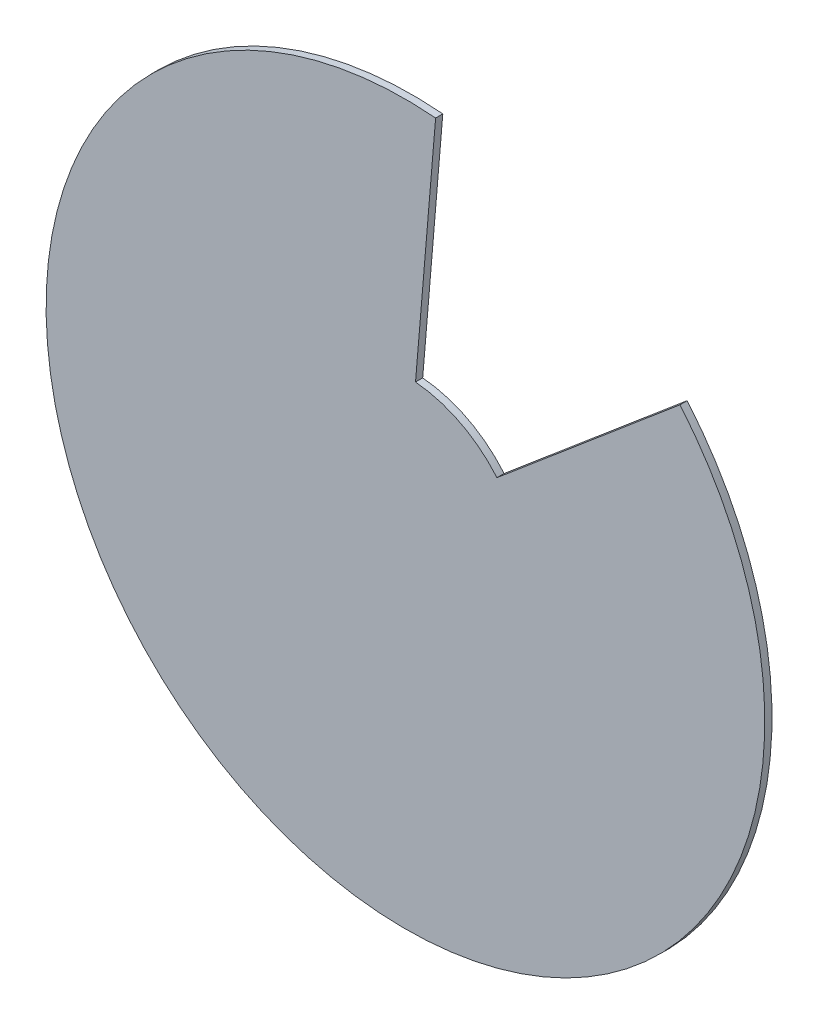
ISO-10303-21;
HEADER;
FILE_DESCRIPTION(('STEP AP214'),'2;1');
FILE_NAME('part.step','',(''),(''),'','','');
FILE_SCHEMA(('AUTOMOTIVE_DESIGN { 1 0 10303 214 1 1 1 1 }'));
ENDSEC;
DATA;
#1=APPLICATION_CONTEXT('core data for automotive mechanical design processes');
#2=APPLICATION_PROTOCOL_DEFINITION('international standard','automotive_design',2000,#1);
#3=PRODUCT_CONTEXT('',#1,'mechanical');
#4=PRODUCT('Part','Part','',(#3));
#5=PRODUCT_RELATED_PRODUCT_CATEGORY('part','',(#4));
#6=PRODUCT_DEFINITION_FORMATION('','',#4);
#7=PRODUCT_DEFINITION_CONTEXT('part definition',#1,'design');
#8=PRODUCT_DEFINITION('design','',#6,#7);
#9=PRODUCT_DEFINITION_SHAPE('','',#8);
#10=(LENGTH_UNIT() NAMED_UNIT(*) SI_UNIT(.MILLI.,.METRE.));
#11=(NAMED_UNIT(*) PLANE_ANGLE_UNIT() SI_UNIT($,.RADIAN.));
#12=(NAMED_UNIT(*) SI_UNIT($,.STERADIAN.) SOLID_ANGLE_UNIT());
#13=UNCERTAINTY_MEASURE_WITH_UNIT(LENGTH_MEASURE(1.E-05),#10,'distance_accuracy_value','');
#14=(GEOMETRIC_REPRESENTATION_CONTEXT(3) GLOBAL_UNCERTAINTY_ASSIGNED_CONTEXT((#13)) GLOBAL_UNIT_ASSIGNED_CONTEXT((#10,
#11,#12)) REPRESENTATION_CONTEXT('',''));
#15=CARTESIAN_POINT('',(0.,0.,0.));
#16=DIRECTION('',(0.,0.,1.));
#17=DIRECTION('',(1.,0.,0.));
#18=AXIS2_PLACEMENT_3D('',#15,#16,#17);
#19=CARTESIAN_POINT('',(0.,0.,3.));
#20=DIRECTION('',(0.,0.,-1.));
#21=DIRECTION('',(-1.,0.,0.));
#22=AXIS2_PLACEMENT_3D('',#19,#20,#21);
#23=CYLINDRICAL_SURFACE('',#22,50.);
#24=CARTESIAN_POINT('',(0.,0.,0.));
#25=DIRECTION('',(0.,0.,1.));
#26=DIRECTION('',(1.,0.,0.));
#27=AXIS2_PLACEMENT_3D('',#24,#25,#26);
#28=CIRCLE('',#27,50.);
#29=CARTESIAN_POINT('',(38.1984908344286,32.2625990579197,0.));
#30=VERTEX_POINT('',#29);
#31=CARTESIAN_POINT('',(4.19730932755882,49.8235144726743,0.));
#32=VERTEX_POINT('',#31);
#33=EDGE_CURVE('E96',#30,#32,#28,.T.);
#34=ORIENTED_EDGE('',*,*,#33,.T.);
#35=DIRECTION('',(0.,0.,-1.));
#36=VECTOR('',#35,1.);
#37=CARTESIAN_POINT('',(4.19730932755882,49.8235144726743,3.));
#38=LINE('',#37,#36);
#39=CARTESIAN_POINT('',(4.19730932755882,49.8235144726743,3.));
#40=VERTEX_POINT('',#39);
#41=EDGE_CURVE('E11',#40,#32,#38,.T.);
#42=ORIENTED_EDGE('',*,*,#41,.F.);
#43=CARTESIAN_POINT('',(0.,0.,3.));
#44=DIRECTION('',(0.,0.,1.));
#45=DIRECTION('',(1.,0.,0.));
#46=AXIS2_PLACEMENT_3D('',#43,#44,#45);
#47=CIRCLE('',#46,50.);
#48=CARTESIAN_POINT('',(38.1984908344286,32.2625990579197,3.));
#49=VERTEX_POINT('',#48);
#50=EDGE_CURVE('E84',#49,#40,#47,.T.);
#51=ORIENTED_EDGE('',*,*,#50,.F.);
#52=DIRECTION('',(0.,0.,-1.));
#53=VECTOR('',#52,1.);
#54=CARTESIAN_POINT('',(38.1984908344286,32.2625990579197,3.));
#55=LINE('',#54,#53);
#56=EDGE_CURVE('E92',#49,#30,#55,.T.);
#57=ORIENTED_EDGE('',*,*,#56,.T.);
#58=EDGE_LOOP('',(#34,#42,#51,#57));
#59=FACE_BOUND('',#58,.T.);
#60=ADVANCED_FACE('F33',(#59),#23,.T.);
#61=CARTESIAN_POINT('',(4.19730932755882,49.8235144726743,3.));
#62=DIRECTION('',(-0.996470289453486,0.0839461865511763,0.));
#63=DIRECTION('',(-0.0839461865511763,-0.996470289453486,0.));
#64=AXIS2_PLACEMENT_3D('',#61,#62,#63);
#65=PLANE('',#64);
#66=DIRECTION('',(0.0839461865511763,0.996470289453487,0.));
#67=VECTOR('',#66,1.);
#68=CARTESIAN_POINT('',(4.19730932755882,49.8235144726743,0.));
#69=LINE('',#68,#67);
#70=CARTESIAN_POINT('',(12.5919279826765,149.470543418023,0.));
#71=VERTEX_POINT('',#70);
#72=EDGE_CURVE('E88',#32,#71,#69,.T.);
#73=ORIENTED_EDGE('',*,*,#72,.T.);
#74=DIRECTION('',(0.,0.,-1.));
#75=VECTOR('',#74,1.);
#76=CARTESIAN_POINT('',(12.5919279826765,149.470543418023,3.));
#77=LINE('',#76,#75);
#78=CARTESIAN_POINT('',(12.5919279826765,149.470543418023,3.));
#79=VERTEX_POINT('',#78);
#80=EDGE_CURVE('E41',#79,#71,#77,.T.);
#81=ORIENTED_EDGE('',*,*,#80,.F.);
#82=DIRECTION('',(0.0839461865511763,0.996470289453487,0.));
#83=VECTOR('',#82,1.);
#84=CARTESIAN_POINT('',(4.19730932755882,49.8235144726743,3.));
#85=LINE('',#84,#83);
#86=EDGE_CURVE('E79',#40,#79,#85,.T.);
#87=ORIENTED_EDGE('',*,*,#86,.F.);
#88=ORIENTED_EDGE('',*,*,#41,.T.);
#89=EDGE_LOOP('',(#73,#81,#87,#88));
#90=FACE_BOUND('',#89,.T.);
#91=ADVANCED_FACE('F87',(#90),#65,.F.);
#92=CARTESIAN_POINT('',(0.,0.,3.));
#93=DIRECTION('',(0.,0.,-1.));
#94=DIRECTION('',(-1.,0.,0.));
#95=AXIS2_PLACEMENT_3D('',#92,#93,#94);
#96=CYLINDRICAL_SURFACE('',#95,150.);
#97=CARTESIAN_POINT('',(0.,0.,0.));
#98=DIRECTION('',(0.,0.,1.));
#99=DIRECTION('',(1.,0.,0.));
#100=AXIS2_PLACEMENT_3D('',#97,#98,#99);
#101=CIRCLE('',#100,150.);
#102=CARTESIAN_POINT('',(114.595472503286,96.7877971737589,0.));
#103=VERTEX_POINT('',#102);
#104=EDGE_CURVE('E66',#71,#103,#101,.T.);
#105=ORIENTED_EDGE('',*,*,#104,.T.);
#106=DIRECTION('',(0.,0.,-1.));
#107=VECTOR('',#106,1.);
#108=CARTESIAN_POINT('',(114.595472503286,96.7877971737589,3.));
#109=LINE('',#108,#107);
#110=CARTESIAN_POINT('',(114.595472503286,96.7877971737589,3.));
#111=VERTEX_POINT('',#110);
#112=EDGE_CURVE('E89',#111,#103,#109,.T.);
#113=ORIENTED_EDGE('',*,*,#112,.F.);
#114=CARTESIAN_POINT('',(0.,0.,3.));
#115=DIRECTION('',(0.,0.,1.));
#116=DIRECTION('',(1.,0.,0.));
#117=AXIS2_PLACEMENT_3D('',#114,#115,#116);
#118=CIRCLE('',#117,150.);
#119=EDGE_CURVE('E82',#79,#111,#118,.T.);
#120=ORIENTED_EDGE('',*,*,#119,.F.);
#121=ORIENTED_EDGE('',*,*,#80,.T.);
#122=EDGE_LOOP('',(#105,#113,#120,#121));
#123=FACE_BOUND('',#122,.T.);
#124=ADVANCED_FACE('F90',(#123),#96,.T.);
#125=CARTESIAN_POINT('',(38.1984908344286,32.2625990579197,3.));
#126=DIRECTION('',(0.645251981158393,-0.763969816688571,0.));
#127=DIRECTION('',(0.763969816688571,0.645251981158393,0.));
#128=AXIS2_PLACEMENT_3D('',#125,#126,#127);
#129=PLANE('',#128);
#130=DIRECTION('',(-0.763969816688571,-0.645251981158393,0.));
#131=VECTOR('',#130,1.);
#132=CARTESIAN_POINT('',(38.1984908344286,32.2625990579197,0.));
#133=LINE('',#132,#131);
#134=EDGE_CURVE('E72',#103,#30,#133,.T.);
#135=ORIENTED_EDGE('',*,*,#134,.T.);
#136=ORIENTED_EDGE('',*,*,#56,.F.);
#137=DIRECTION('',(-0.763969816688571,-0.645251981158393,0.));
#138=VECTOR('',#137,1.);
#139=CARTESIAN_POINT('',(38.1984908344286,32.2625990579197,3.));
#140=LINE('',#139,#138);
#141=EDGE_CURVE('E49',#111,#49,#140,.T.);
#142=ORIENTED_EDGE('',*,*,#141,.F.);
#143=ORIENTED_EDGE('',*,*,#112,.T.);
#144=EDGE_LOOP('',(#135,#136,#142,#143));
#145=FACE_BOUND('',#144,.T.);
#146=ADVANCED_FACE('F103',(#145),#129,.F.);
#147=CARTESIAN_POINT('',(0.,0.,3.));
#148=DIRECTION('',(0.,0.,1.));
#149=DIRECTION('',(1.,0.,0.));
#150=AXIS2_PLACEMENT_3D('',#147,#148,#149);
#151=PLANE('',#150);
#152=ORIENTED_EDGE('',*,*,#50,.T.);
#153=ORIENTED_EDGE('',*,*,#86,.T.);
#154=ORIENTED_EDGE('',*,*,#119,.T.);
#155=ORIENTED_EDGE('',*,*,#141,.T.);
#156=EDGE_LOOP('',(#152,#153,#154,#155));
#157=FACE_BOUND('',#156,.T.);
#158=ADVANCED_FACE('F80',(#157),#151,.T.);
#159=CARTESIAN_POINT('',(0.,0.,0.));
#160=DIRECTION('',(0.,0.,1.));
#161=DIRECTION('',(1.,0.,0.));
#162=AXIS2_PLACEMENT_3D('',#159,#160,#161);
#163=PLANE('',#162);
#164=ORIENTED_EDGE('',*,*,#33,.F.);
#165=ORIENTED_EDGE('',*,*,#134,.F.);
#166=ORIENTED_EDGE('',*,*,#104,.F.);
#167=ORIENTED_EDGE('',*,*,#72,.F.);
#168=EDGE_LOOP('',(#164,#165,#166,#167));
#169=FACE_BOUND('',#168,.T.);
#170=ADVANCED_FACE('F106',(#169),#163,.F.);
#171=CLOSED_SHELL('',(#60,#91,#124,#146,#158,#170));
#172=MANIFOLD_SOLID_BREP('B2',#171);
#173=ADVANCED_BREP_SHAPE_REPRESENTATION('',(#18,#172),#14);
#174=SHAPE_DEFINITION_REPRESENTATION(#9,#173);
ENDSEC;
END-ISO-10303-21;
